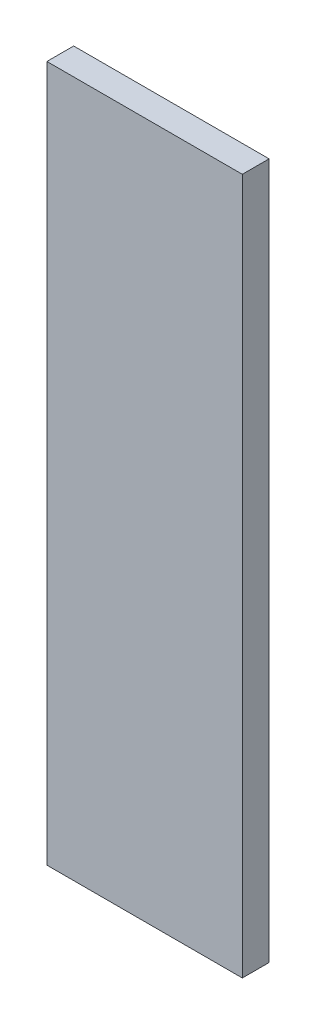
ISO-10303-21;
HEADER;
FILE_DESCRIPTION(('STEP AP214'),'2;1');
FILE_NAME('part.step','',(''),(''),'','','');
FILE_SCHEMA(('AUTOMOTIVE_DESIGN { 1 0 10303 214 1 1 1 1 }'));
ENDSEC;
DATA;
#1=APPLICATION_CONTEXT('core data for automotive mechanical design processes');
#2=APPLICATION_PROTOCOL_DEFINITION('international standard','automotive_design',2000,#1);
#3=PRODUCT_CONTEXT('',#1,'mechanical');
#4=PRODUCT('Part','Part','',(#3));
#5=PRODUCT_RELATED_PRODUCT_CATEGORY('part','',(#4));
#6=PRODUCT_DEFINITION_FORMATION('','',#4);
#7=PRODUCT_DEFINITION_CONTEXT('part definition',#1,'design');
#8=PRODUCT_DEFINITION('design','',#6,#7);
#9=PRODUCT_DEFINITION_SHAPE('','',#8);
#10=(LENGTH_UNIT() NAMED_UNIT(*) SI_UNIT(.MILLI.,.METRE.));
#11=(NAMED_UNIT(*) PLANE_ANGLE_UNIT() SI_UNIT($,.RADIAN.));
#12=(NAMED_UNIT(*) SI_UNIT($,.STERADIAN.) SOLID_ANGLE_UNIT());
#13=UNCERTAINTY_MEASURE_WITH_UNIT(LENGTH_MEASURE(1.E-05),#10,'distance_accuracy_value','');
#14=(GEOMETRIC_REPRESENTATION_CONTEXT(3) GLOBAL_UNCERTAINTY_ASSIGNED_CONTEXT((#13)) GLOBAL_UNIT_ASSIGNED_CONTEXT((#10,
#11,#12)) REPRESENTATION_CONTEXT('',''));
#15=CARTESIAN_POINT('',(0.,0.,0.));
#16=DIRECTION('',(0.,0.,1.));
#17=DIRECTION('',(1.,0.,0.));
#18=AXIS2_PLACEMENT_3D('',#15,#16,#17);
#19=CARTESIAN_POINT('',(0.,0.,2.54));
#20=DIRECTION('',(1.,0.,0.));
#21=DIRECTION('',(0.,0.,-1.));
#22=AXIS2_PLACEMENT_3D('',#19,#20,#21);
#23=PLANE('',#22);
#24=DIRECTION('',(0.,-1.,0.));
#25=VECTOR('',#24,1.);
#26=CARTESIAN_POINT('',(0.,0.,0.));
#27=LINE('',#26,#25);
#28=CARTESIAN_POINT('',(0.,66.04,0.));
#29=VERTEX_POINT('',#28);
#30=CARTESIAN_POINT('',(0.,0.,0.));
#31=VERTEX_POINT('',#30);
#32=EDGE_CURVE('E96',#29,#31,#27,.T.);
#33=ORIENTED_EDGE('',*,*,#32,.T.);
#34=DIRECTION('',(0.,0.,-1.));
#35=VECTOR('',#34,1.);
#36=CARTESIAN_POINT('',(0.,0.,2.54));
#37=LINE('',#36,#35);
#38=CARTESIAN_POINT('',(0.,0.,2.54));
#39=VERTEX_POINT('',#38);
#40=EDGE_CURVE('E11',#39,#31,#37,.T.);
#41=ORIENTED_EDGE('',*,*,#40,.F.);
#42=DIRECTION('',(0.,-1.,0.));
#43=VECTOR('',#42,1.);
#44=CARTESIAN_POINT('',(0.,0.,2.54));
#45=LINE('',#44,#43);
#46=CARTESIAN_POINT('',(0.,66.04,2.54));
#47=VERTEX_POINT('',#46);
#48=EDGE_CURVE('E84',#47,#39,#45,.T.);
#49=ORIENTED_EDGE('',*,*,#48,.F.);
#50=DIRECTION('',(0.,0.,-1.));
#51=VECTOR('',#50,1.);
#52=CARTESIAN_POINT('',(0.,66.04,2.54));
#53=LINE('',#52,#51);
#54=EDGE_CURVE('E92',#47,#29,#53,.T.);
#55=ORIENTED_EDGE('',*,*,#54,.T.);
#56=EDGE_LOOP('',(#33,#41,#49,#55));
#57=FACE_BOUND('',#56,.T.);
#58=ADVANCED_FACE('F33',(#57),#23,.F.);
#59=CARTESIAN_POINT('',(0.,0.,2.54));
#60=DIRECTION('',(0.,1.,0.));
#61=DIRECTION('',(0.,0.,1.));
#62=AXIS2_PLACEMENT_3D('',#59,#60,#61);
#63=PLANE('',#62);
#64=DIRECTION('',(1.,0.,0.));
#65=VECTOR('',#64,1.);
#66=CARTESIAN_POINT('',(0.,0.,0.));
#67=LINE('',#66,#65);
#68=CARTESIAN_POINT('',(18.542,0.,0.));
#69=VERTEX_POINT('',#68);
#70=EDGE_CURVE('E88',#31,#69,#67,.T.);
#71=ORIENTED_EDGE('',*,*,#70,.T.);
#72=DIRECTION('',(0.,0.,-1.));
#73=VECTOR('',#72,1.);
#74=CARTESIAN_POINT('',(18.542,0.,2.54));
#75=LINE('',#74,#73);
#76=CARTESIAN_POINT('',(18.542,0.,2.54));
#77=VERTEX_POINT('',#76);
#78=EDGE_CURVE('E41',#77,#69,#75,.T.);
#79=ORIENTED_EDGE('',*,*,#78,.F.);
#80=DIRECTION('',(1.,0.,0.));
#81=VECTOR('',#80,1.);
#82=CARTESIAN_POINT('',(0.,0.,2.54));
#83=LINE('',#82,#81);
#84=EDGE_CURVE('E79',#39,#77,#83,.T.);
#85=ORIENTED_EDGE('',*,*,#84,.F.);
#86=ORIENTED_EDGE('',*,*,#40,.T.);
#87=EDGE_LOOP('',(#71,#79,#85,#86));
#88=FACE_BOUND('',#87,.T.);
#89=ADVANCED_FACE('F87',(#88),#63,.F.);
#90=CARTESIAN_POINT('',(18.542,0.,2.54));
#91=DIRECTION('',(-1.,0.,0.));
#92=DIRECTION('',(0.,0.,1.));
#93=AXIS2_PLACEMENT_3D('',#90,#91,#92);
#94=PLANE('',#93);
#95=DIRECTION('',(0.,1.,0.));
#96=VECTOR('',#95,1.);
#97=CARTESIAN_POINT('',(18.542,0.,0.));
#98=LINE('',#97,#96);
#99=CARTESIAN_POINT('',(18.542,66.04,0.));
#100=VERTEX_POINT('',#99);
#101=EDGE_CURVE('E66',#69,#100,#98,.T.);
#102=ORIENTED_EDGE('',*,*,#101,.T.);
#103=DIRECTION('',(0.,0.,-1.));
#104=VECTOR('',#103,1.);
#105=CARTESIAN_POINT('',(18.542,66.04,2.54));
#106=LINE('',#105,#104);
#107=CARTESIAN_POINT('',(18.542,66.04,2.54));
#108=VERTEX_POINT('',#107);
#109=EDGE_CURVE('E89',#108,#100,#106,.T.);
#110=ORIENTED_EDGE('',*,*,#109,.F.);
#111=DIRECTION('',(0.,1.,0.));
#112=VECTOR('',#111,1.);
#113=CARTESIAN_POINT('',(18.542,0.,2.54));
#114=LINE('',#113,#112);
#115=EDGE_CURVE('E82',#77,#108,#114,.T.);
#116=ORIENTED_EDGE('',*,*,#115,.F.);
#117=ORIENTED_EDGE('',*,*,#78,.T.);
#118=EDGE_LOOP('',(#102,#110,#116,#117));
#119=FACE_BOUND('',#118,.T.);
#120=ADVANCED_FACE('F90',(#119),#94,.F.);
#121=CARTESIAN_POINT('',(0.,66.04,2.54));
#122=DIRECTION('',(0.,-1.,0.));
#123=DIRECTION('',(0.,0.,-1.));
#124=AXIS2_PLACEMENT_3D('',#121,#122,#123);
#125=PLANE('',#124);
#126=DIRECTION('',(-1.,0.,0.));
#127=VECTOR('',#126,1.);
#128=CARTESIAN_POINT('',(0.,66.04,0.));
#129=LINE('',#128,#127);
#130=EDGE_CURVE('E72',#100,#29,#129,.T.);
#131=ORIENTED_EDGE('',*,*,#130,.T.);
#132=ORIENTED_EDGE('',*,*,#54,.F.);
#133=DIRECTION('',(-1.,0.,0.));
#134=VECTOR('',#133,1.);
#135=CARTESIAN_POINT('',(0.,66.04,2.54));
#136=LINE('',#135,#134);
#137=EDGE_CURVE('E49',#108,#47,#136,.T.);
#138=ORIENTED_EDGE('',*,*,#137,.F.);
#139=ORIENTED_EDGE('',*,*,#109,.T.);
#140=EDGE_LOOP('',(#131,#132,#138,#139));
#141=FACE_BOUND('',#140,.T.);
#142=ADVANCED_FACE('F103',(#141),#125,.F.);
#143=CARTESIAN_POINT('',(0.,0.,2.54));
#144=DIRECTION('',(0.,0.,-1.));
#145=DIRECTION('',(-1.,0.,0.));
#146=AXIS2_PLACEMENT_3D('',#143,#144,#145);
#147=PLANE('',#146);
#148=ORIENTED_EDGE('',*,*,#48,.T.);
#149=ORIENTED_EDGE('',*,*,#84,.T.);
#150=ORIENTED_EDGE('',*,*,#115,.T.);
#151=ORIENTED_EDGE('',*,*,#137,.T.);
#152=EDGE_LOOP('',(#148,#149,#150,#151));
#153=FACE_BOUND('',#152,.T.);
#154=ADVANCED_FACE('F80',(#153),#147,.F.);
#155=CARTESIAN_POINT('',(0.,0.,0.));
#156=DIRECTION('',(0.,0.,-1.));
#157=DIRECTION('',(-1.,0.,0.));
#158=AXIS2_PLACEMENT_3D('',#155,#156,#157);
#159=PLANE('',#158);
#160=ORIENTED_EDGE('',*,*,#32,.F.);
#161=ORIENTED_EDGE('',*,*,#130,.F.);
#162=ORIENTED_EDGE('',*,*,#101,.F.);
#163=ORIENTED_EDGE('',*,*,#70,.F.);
#164=EDGE_LOOP('',(#160,#161,#162,#163));
#165=FACE_BOUND('',#164,.T.);
#166=ADVANCED_FACE('F106',(#165),#159,.T.);
#167=CLOSED_SHELL('',(#58,#89,#120,#142,#154,#166));
#168=MANIFOLD_SOLID_BREP('B2',#167);
#169=ADVANCED_BREP_SHAPE_REPRESENTATION('',(#18,#168),#14);
#170=SHAPE_DEFINITION_REPRESENTATION(#9,#169);
ENDSEC;
END-ISO-10303-21;
